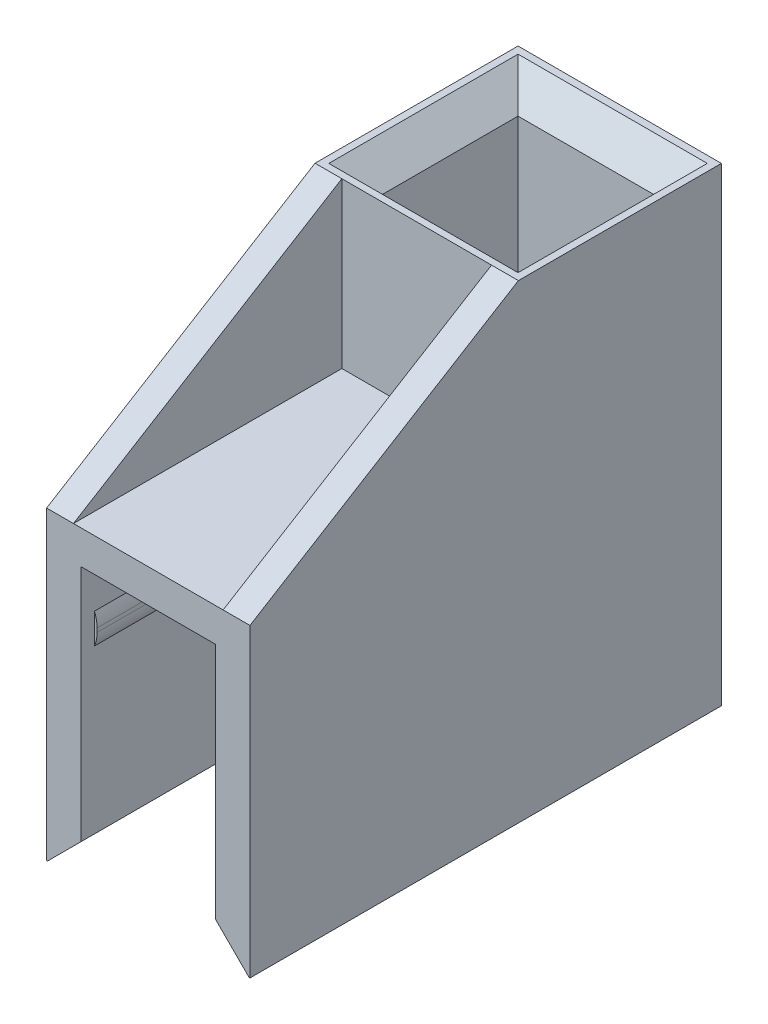
ISO-10303-21;
HEADER;
FILE_DESCRIPTION(('STEP AP214'),'2;1');
FILE_NAME('part.step','',(''),(''),'','','');
FILE_SCHEMA(('AUTOMOTIVE_DESIGN { 1 0 10303 214 1 1 1 1 }'));
ENDSEC;
DATA;
#1=APPLICATION_CONTEXT('core data for automotive mechanical design processes');
#2=APPLICATION_PROTOCOL_DEFINITION('international standard','automotive_design',2000,#1);
#3=PRODUCT_CONTEXT('',#1,'mechanical');
#4=PRODUCT('Part','Part','',(#3));
#5=PRODUCT_RELATED_PRODUCT_CATEGORY('part','',(#4));
#6=PRODUCT_DEFINITION_FORMATION('','',#4);
#7=PRODUCT_DEFINITION_CONTEXT('part definition',#1,'design');
#8=PRODUCT_DEFINITION('design','',#6,#7);
#9=PRODUCT_DEFINITION_SHAPE('','',#8);
#10=(LENGTH_UNIT() NAMED_UNIT(*) SI_UNIT(.MILLI.,.METRE.));
#11=(NAMED_UNIT(*) PLANE_ANGLE_UNIT() SI_UNIT($,.RADIAN.));
#12=(NAMED_UNIT(*) SI_UNIT($,.STERADIAN.) SOLID_ANGLE_UNIT());
#13=UNCERTAINTY_MEASURE_WITH_UNIT(LENGTH_MEASURE(1.E-05),#10,'distance_accuracy_value','');
#14=(GEOMETRIC_REPRESENTATION_CONTEXT(3) GLOBAL_UNCERTAINTY_ASSIGNED_CONTEXT((#13)) GLOBAL_UNIT_ASSIGNED_CONTEXT((#10,
#11,#12)) REPRESENTATION_CONTEXT('',''));
#15=CARTESIAN_POINT('',(0.,0.,0.));
#16=DIRECTION('',(0.,0.,1.));
#17=DIRECTION('',(1.,0.,0.));
#18=AXIS2_PLACEMENT_3D('',#15,#16,#17);
#19=CARTESIAN_POINT('',(10.025,0.,40.));
#20=DIRECTION('',(1.,0.,0.));
#21=DIRECTION('',(0.,0.,-1.));
#22=AXIS2_PLACEMENT_3D('',#19,#20,#21);
#23=PLANE('',#22);
#24=DIRECTION('',(0.,-1.,0.));
#25=VECTOR('',#24,1.);
#26=CARTESIAN_POINT('',(10.025,0.,0.));
#27=LINE('',#26,#25);
#28=CARTESIAN_POINT('',(10.025,20.5,0.));
#29=VERTEX_POINT('',#28);
#30=CARTESIAN_POINT('',(10.025,-15.,0.));
#31=VERTEX_POINT('',#30);
#32=EDGE_CURVE('E311',#29,#31,#27,.T.);
#33=ORIENTED_EDGE('',*,*,#32,.T.);
#34=DIRECTION('',(0.,0.,1.));
#35=VECTOR('',#34,1.);
#36=CARTESIAN_POINT('',(10.025,-15.,40.));
#37=LINE('',#36,#35);
#38=CARTESIAN_POINT('',(10.025,-15.,40.));
#39=VERTEX_POINT('',#38);
#40=EDGE_CURVE('E432',#31,#39,#37,.T.);
#41=ORIENTED_EDGE('',*,*,#40,.T.);
#42=DIRECTION('',(0.,-1.,0.));
#43=VECTOR('',#42,1.);
#44=CARTESIAN_POINT('',(10.025,0.,40.));
#45=LINE('',#44,#43);
#46=CARTESIAN_POINT('',(10.025,20.5,40.));
#47=VERTEX_POINT('',#46);
#48=EDGE_CURVE('E326',#47,#39,#45,.T.);
#49=ORIENTED_EDGE('',*,*,#48,.F.);
#50=DIRECTION('',(0.,0.,-1.));
#51=VECTOR('',#50,1.);
#52=CARTESIAN_POINT('',(10.025,20.5,40.));
#53=LINE('',#52,#51);
#54=EDGE_CURVE('E331',#47,#29,#53,.T.);
#55=ORIENTED_EDGE('',*,*,#54,.T.);
#56=EDGE_LOOP('',(#33,#41,#49,#55));
#57=FACE_BOUND('',#56,.T.);
#58=DIRECTION('',(0.,0.,1.));
#59=VECTOR('',#58,1.);
#60=CARTESIAN_POINT('',(10.025,9.25000000000001,0.));
#61=LINE('',#60,#59);
#62=CARTESIAN_POINT('',(10.025,9.25000000000001,2.));
#63=VERTEX_POINT('',#62);
#64=CARTESIAN_POINT('',(10.025,9.25000000000001,38.));
#65=VERTEX_POINT('',#64);
#66=EDGE_CURVE('E229',#63,#65,#61,.T.);
#67=ORIENTED_EDGE('',*,*,#66,.F.);
#68=DIRECTION('',(0.,-1.,0.));
#69=VECTOR('',#68,1.);
#70=CARTESIAN_POINT('',(10.025,0.,2.));
#71=LINE('',#70,#69);
#72=CARTESIAN_POINT('',(10.025,13.75,2.));
#73=VERTEX_POINT('',#72);
#74=EDGE_CURVE('E230',#73,#63,#71,.T.);
#75=ORIENTED_EDGE('',*,*,#74,.F.);
#76=DIRECTION('',(0.,0.,-1.));
#77=VECTOR('',#76,1.);
#78=CARTESIAN_POINT('',(10.025,13.75,0.));
#79=LINE('',#78,#77);
#80=CARTESIAN_POINT('',(10.025,13.75,38.));
#81=VERTEX_POINT('',#80);
#82=EDGE_CURVE('E237',#81,#73,#79,.T.);
#83=ORIENTED_EDGE('',*,*,#82,.F.);
#84=DIRECTION('',(0.,-1.,0.));
#85=VECTOR('',#84,1.);
#86=CARTESIAN_POINT('',(10.025,0.,38.));
#87=LINE('',#86,#85);
#88=EDGE_CURVE('E232',#81,#65,#87,.T.);
#89=ORIENTED_EDGE('',*,*,#88,.T.);
#90=EDGE_LOOP('',(#67,#75,#83,#89));
#91=FACE_BOUND('',#90,.T.);
#92=ADVANCED_FACE('F43',(#57,#91),#23,.F.);
#93=CARTESIAN_POINT('',(62.0568225314826,52.2270196568572,-3.63595046017497));
#94=DIRECTION('',(0.,0.85275441484345,0.522312079091614));
#95=DIRECTION('',(0.,-0.522312079091614,0.852754414843451));
#96=AXIS2_PLACEMENT_3D('',#93,#94,#95);
#97=PLANE('',#96);
#98=DIRECTION('',(-1.,0.,0.));
#99=VECTOR('',#98,1.);
#100=CARTESIAN_POINT('',(0.,25.5,40.));
#101=LINE('',#100,#99);
#102=CARTESIAN_POINT('',(-11.15,25.5,40.));
#103=VERTEX_POINT('',#102);
#104=CARTESIAN_POINT('',(-15.15,25.5,40.));
#105=VERTEX_POINT('',#104);
#106=EDGE_CURVE('E310',#103,#105,#101,.T.);
#107=ORIENTED_EDGE('',*,*,#106,.F.);
#108=DIRECTION('',(0.,0.522312079091614,-0.852754414843451));
#109=VECTOR('',#108,1.);
#110=CARTESIAN_POINT('',(-11.15,52.2270196568572,-3.63595046017497));
#111=LINE('',#110,#109);
#112=CARTESIAN_POINT('',(-11.15,50.,0.));
#113=VERTEX_POINT('',#112);
#114=EDGE_CURVE('E422',#103,#113,#111,.T.);
#115=ORIENTED_EDGE('',*,*,#114,.T.);
#116=DIRECTION('',(-1.,0.,0.));
#117=VECTOR('',#116,1.);
#118=CARTESIAN_POINT('',(-15.15,50.,0.));
#119=LINE('',#118,#117);
#120=CARTESIAN_POINT('',(-15.15,50.,0.));
#121=VERTEX_POINT('',#120);
#122=EDGE_CURVE('E377',#113,#121,#119,.T.);
#123=ORIENTED_EDGE('',*,*,#122,.T.);
#124=DIRECTION('',(0.,0.522312079091614,-0.852754414843451));
#125=VECTOR('',#124,1.);
#126=CARTESIAN_POINT('',(-15.15,52.2270196568572,-3.63595046017497));
#127=LINE('',#126,#125);
#128=EDGE_CURVE('E301',#105,#121,#127,.T.);
#129=ORIENTED_EDGE('',*,*,#128,.F.);
#130=EDGE_LOOP('',(#107,#115,#123,#129));
#131=FACE_BOUND('',#130,.T.);
#132=ADVANCED_FACE('F486',(#131),#97,.T.);
#133=CARTESIAN_POINT('',(15.15,50.,0.));
#134=VERTEX_POINT('',#133);
#135=CARTESIAN_POINT('',(11.15,50.,0.));
#136=VERTEX_POINT('',#135);
#137=EDGE_CURVE('E378',#134,#136,#119,.T.);
#138=ORIENTED_EDGE('',*,*,#137,.T.);
#139=DIRECTION('',(0.,-0.522312079091614,0.852754414843451));
#140=VECTOR('',#139,1.);
#141=CARTESIAN_POINT('',(11.15,52.2270196568572,-3.63595046017497));
#142=LINE('',#141,#140);
#143=CARTESIAN_POINT('',(11.15,25.5,40.));
#144=VERTEX_POINT('',#143);
#145=EDGE_CURVE('E411',#136,#144,#142,.T.);
#146=ORIENTED_EDGE('',*,*,#145,.T.);
#147=CARTESIAN_POINT('',(15.15,25.5,40.));
#148=VERTEX_POINT('',#147);
#149=EDGE_CURVE('E312',#148,#144,#101,.T.);
#150=ORIENTED_EDGE('',*,*,#149,.F.);
#151=DIRECTION('',(0.,0.522312079091614,-0.852754414843451));
#152=VECTOR('',#151,1.);
#153=CARTESIAN_POINT('',(15.15,52.2270196568572,-3.63595046017497));
#154=LINE('',#153,#152);
#155=EDGE_CURVE('E304',#148,#134,#154,.T.);
#156=ORIENTED_EDGE('',*,*,#155,.T.);
#157=EDGE_LOOP('',(#138,#146,#150,#156));
#158=FACE_BOUND('',#157,.T.);
#159=ADVANCED_FACE('F492',(#158),#97,.T.);
#160=CARTESIAN_POINT('',(0.,0.,0.));
#161=DIRECTION('',(0.,0.,1.));
#162=DIRECTION('',(1.,0.,0.));
#163=AXIS2_PLACEMENT_3D('',#160,#161,#162);
#164=PLANE('',#163);
#165=DIRECTION('',(0.,-1.,0.));
#166=VECTOR('',#165,1.);
#167=CARTESIAN_POINT('',(-10.025,0.,0.));
#168=LINE('',#167,#166);
#169=CARTESIAN_POINT('',(-10.025,20.5,0.));
#170=VERTEX_POINT('',#169);
#171=CARTESIAN_POINT('',(-10.025,-15.,0.));
#172=VERTEX_POINT('',#171);
#173=EDGE_CURVE('E306',#170,#172,#168,.T.);
#174=ORIENTED_EDGE('',*,*,#173,.T.);
#175=DIRECTION('',(1.,0.,0.));
#176=VECTOR('',#175,1.);
#177=CARTESIAN_POINT('',(0.,-15.,0.));
#178=LINE('',#177,#176);
#179=EDGE_CURVE('E438',#172,#31,#178,.T.);
#180=ORIENTED_EDGE('',*,*,#179,.T.);
#181=ORIENTED_EDGE('',*,*,#32,.F.);
#182=DIRECTION('',(-1.,0.,0.));
#183=VECTOR('',#182,1.);
#184=CARTESIAN_POINT('',(0.,20.5,0.));
#185=LINE('',#184,#183);
#186=EDGE_CURVE('E334',#29,#170,#185,.T.);
#187=ORIENTED_EDGE('',*,*,#186,.T.);
#188=EDGE_LOOP('',(#174,#180,#181,#187));
#189=FACE_BOUND('',#188,.T.);
#190=ADVANCED_FACE('F531',(#189),#164,.T.);
#191=CARTESIAN_POINT('',(0.,0.,-5.));
#192=DIRECTION('',(0.,0.,1.));
#193=DIRECTION('',(1.,0.,0.));
#194=AXIS2_PLACEMENT_3D('',#191,#192,#193);
#195=PLANE('',#194);
#196=DIRECTION('',(0.,-1.,0.));
#197=VECTOR('',#196,1.);
#198=CARTESIAN_POINT('',(-10.1,89.4417608633286,-5.));
#199=LINE('',#198,#197);
#200=CARTESIAN_POINT('',(-10.1,46.,-5.));
#201=VERTEX_POINT('',#200);
#202=CARTESIAN_POINT('',(-10.1,-16.,-5.));
#203=VERTEX_POINT('',#202);
#204=EDGE_CURVE('E371',#201,#203,#199,.T.);
#205=ORIENTED_EDGE('',*,*,#204,.F.);
#206=DIRECTION('',(1.,0.,0.));
#207=VECTOR('',#206,1.);
#208=CARTESIAN_POINT('',(10.1,46.,-5.));
#209=LINE('',#208,#207);
#210=CARTESIAN_POINT('',(10.1,46.,-5.));
#211=VERTEX_POINT('',#210);
#212=EDGE_CURVE('E402',#201,#211,#209,.T.);
#213=ORIENTED_EDGE('',*,*,#212,.T.);
#214=DIRECTION('',(0.,-1.,0.));
#215=VECTOR('',#214,1.);
#216=CARTESIAN_POINT('',(10.1,89.4417608633286,-5.));
#217=LINE('',#216,#215);
#218=CARTESIAN_POINT('',(10.1,-16.,-5.));
#219=VERTEX_POINT('',#218);
#220=EDGE_CURVE('E361',#211,#219,#217,.T.);
#221=ORIENTED_EDGE('',*,*,#220,.T.);
#222=DIRECTION('',(-1.,0.,0.));
#223=VECTOR('',#222,1.);
#224=CARTESIAN_POINT('',(-15.15,-16.,-5.));
#225=LINE('',#224,#223);
#226=EDGE_CURVE('E347',#219,#203,#225,.T.);
#227=ORIENTED_EDGE('',*,*,#226,.T.);
#228=EDGE_LOOP('',(#205,#213,#221,#227));
#229=FACE_BOUND('',#228,.T.);
#230=ADVANCED_FACE('F527',(#229),#195,.F.);
#231=CARTESIAN_POINT('',(10.1,89.4417608633286,-5.));
#232=DIRECTION('',(-1.,0.,0.));
#233=DIRECTION('',(0.,0.,1.));
#234=AXIS2_PLACEMENT_3D('',#231,#232,#233);
#235=PLANE('',#234);
#236=ORIENTED_EDGE('',*,*,#220,.F.);
#237=DIRECTION('',(0.,0.,-1.));
#238=VECTOR('',#237,1.);
#239=CARTESIAN_POINT('',(10.1,46.,-5.));
#240=LINE('',#239,#238);
#241=CARTESIAN_POINT('',(10.1,46.,-25.2));
#242=VERTEX_POINT('',#241);
#243=EDGE_CURVE('E405',#211,#242,#240,.T.);
#244=ORIENTED_EDGE('',*,*,#243,.T.);
#245=DIRECTION('',(0.,-1.,0.));
#246=VECTOR('',#245,1.);
#247=CARTESIAN_POINT('',(10.1,89.4417608633286,-25.2));
#248=LINE('',#247,#246);
#249=CARTESIAN_POINT('',(10.1,-16.,-25.2));
#250=VERTEX_POINT('',#249);
#251=EDGE_CURVE('E365',#242,#250,#248,.T.);
#252=ORIENTED_EDGE('',*,*,#251,.T.);
#253=DIRECTION('',(0.,0.,1.));
#254=VECTOR('',#253,1.);
#255=CARTESIAN_POINT('',(10.1,-16.,-5.));
#256=LINE('',#255,#254);
#257=EDGE_CURVE('E344',#250,#219,#256,.T.);
#258=ORIENTED_EDGE('',*,*,#257,.T.);
#259=EDGE_LOOP('',(#236,#244,#252,#258));
#260=FACE_BOUND('',#259,.T.);
#261=ADVANCED_FACE('F523',(#260),#235,.T.);
#262=CARTESIAN_POINT('',(-15.15,89.4417608633286,-25.2));
#263=DIRECTION('',(0.,0.,1.));
#264=DIRECTION('',(1.,0.,0.));
#265=AXIS2_PLACEMENT_3D('',#262,#263,#264);
#266=PLANE('',#265);
#267=ORIENTED_EDGE('',*,*,#251,.F.);
#268=DIRECTION('',(-1.,0.,0.));
#269=VECTOR('',#268,1.);
#270=CARTESIAN_POINT('',(-15.15,46.,-25.2));
#271=LINE('',#270,#269);
#272=CARTESIAN_POINT('',(-10.1,46.,-25.2));
#273=VERTEX_POINT('',#272);
#274=EDGE_CURVE('E407',#242,#273,#271,.T.);
#275=ORIENTED_EDGE('',*,*,#274,.T.);
#276=DIRECTION('',(0.,-1.,0.));
#277=VECTOR('',#276,1.);
#278=CARTESIAN_POINT('',(-10.1,89.4417608633286,-25.2));
#279=LINE('',#278,#277);
#280=CARTESIAN_POINT('',(-10.1,-16.,-25.2));
#281=VERTEX_POINT('',#280);
#282=EDGE_CURVE('E373',#273,#281,#279,.T.);
#283=ORIENTED_EDGE('',*,*,#282,.T.);
#284=DIRECTION('',(1.,0.,0.));
#285=VECTOR('',#284,1.);
#286=CARTESIAN_POINT('',(-15.15,-16.,-25.2));
#287=LINE('',#286,#285);
#288=EDGE_CURVE('E354',#281,#250,#287,.T.);
#289=ORIENTED_EDGE('',*,*,#288,.T.);
#290=EDGE_LOOP('',(#267,#275,#283,#289));
#291=FACE_BOUND('',#290,.T.);
#292=ADVANCED_FACE('F519',(#291),#266,.T.);
#293=CARTESIAN_POINT('',(-10.1,89.4417608633286,-5.));
#294=DIRECTION('',(1.,0.,0.));
#295=DIRECTION('',(0.,0.,-1.));
#296=AXIS2_PLACEMENT_3D('',#293,#294,#295);
#297=PLANE('',#296);
#298=ORIENTED_EDGE('',*,*,#282,.F.);
#299=DIRECTION('',(0.,0.,1.));
#300=VECTOR('',#299,1.);
#301=CARTESIAN_POINT('',(-10.1,46.,-5.));
#302=LINE('',#301,#300);
#303=EDGE_CURVE('E409',#273,#201,#302,.T.);
#304=ORIENTED_EDGE('',*,*,#303,.T.);
#305=ORIENTED_EDGE('',*,*,#204,.T.);
#306=DIRECTION('',(0.,0.,-1.));
#307=VECTOR('',#306,1.);
#308=CARTESIAN_POINT('',(-10.1,-16.,-5.));
#309=LINE('',#308,#307);
#310=EDGE_CURVE('E351',#203,#281,#309,.T.);
#311=ORIENTED_EDGE('',*,*,#310,.T.);
#312=EDGE_LOOP('',(#298,#304,#305,#311));
#313=FACE_BOUND('',#312,.T.);
#314=ADVANCED_FACE('F515',(#313),#297,.T.);
#315=CARTESIAN_POINT('',(15.15,50.,-5.));
#316=DIRECTION('',(1.,0.,0.));
#317=DIRECTION('',(0.,1.,0.));
#318=AXIS2_PLACEMENT_3D('',#315,#316,#317);
#319=PLANE('',#318);
#320=DIRECTION('',(0.,0.,1.));
#321=VECTOR('',#320,1.);
#322=CARTESIAN_POINT('',(15.15,50.,-5.));
#323=LINE('',#322,#321);
#324=CARTESIAN_POINT('',(15.15,50.,-30.25));
#325=VERTEX_POINT('',#324);
#326=EDGE_CURVE('E381',#325,#134,#323,.T.);
#327=ORIENTED_EDGE('',*,*,#326,.T.);
#328=ORIENTED_EDGE('',*,*,#155,.F.);
#329=DIRECTION('',(0.,1.,0.));
#330=VECTOR('',#329,1.);
#331=CARTESIAN_POINT('',(15.15,0.,40.));
#332=LINE('',#331,#330);
#333=CARTESIAN_POINT('',(15.15,-20.,40.));
#334=VERTEX_POINT('',#333);
#335=EDGE_CURVE('E307',#334,#148,#332,.T.);
#336=ORIENTED_EDGE('',*,*,#335,.F.);
#337=DIRECTION('',(0.,0.,1.));
#338=VECTOR('',#337,1.);
#339=CARTESIAN_POINT('',(15.15,-20.,-5.));
#340=LINE('',#339,#338);
#341=CARTESIAN_POINT('',(15.15,-20.,-30.25));
#342=VERTEX_POINT('',#341);
#343=EDGE_CURVE('E382',#342,#334,#340,.T.);
#344=ORIENTED_EDGE('',*,*,#343,.F.);
#345=DIRECTION('',(0.,-1.,0.));
#346=VECTOR('',#345,1.);
#347=CARTESIAN_POINT('',(15.15,89.4417608633286,-30.25));
#348=LINE('',#347,#346);
#349=EDGE_CURVE('E362',#325,#342,#348,.T.);
#350=ORIENTED_EDGE('',*,*,#349,.F.);
#351=EDGE_LOOP('',(#327,#328,#336,#344,#350));
#352=FACE_BOUND('',#351,.T.);
#353=ADVANCED_FACE('F518',(#352),#319,.T.);
#354=CARTESIAN_POINT('',(-15.15,-20.,-5.));
#355=DIRECTION('',(0.,-1.,0.));
#356=DIRECTION('',(1.,0.,0.));
#357=AXIS2_PLACEMENT_3D('',#354,#355,#356);
#358=PLANE('',#357);
#359=DIRECTION('',(1.,0.,0.));
#360=VECTOR('',#359,1.);
#361=CARTESIAN_POINT('',(0.,-20.,40.));
#362=LINE('',#361,#360);
#363=CARTESIAN_POINT('',(15.025,-20.,40.));
#364=VERTEX_POINT('',#363);
#365=EDGE_CURVE('E329',#364,#334,#362,.T.);
#366=ORIENTED_EDGE('',*,*,#365,.F.);
#367=DIRECTION('',(0.,0.,-1.));
#368=VECTOR('',#367,1.);
#369=CARTESIAN_POINT('',(15.025,-20.,0.));
#370=LINE('',#369,#368);
#371=CARTESIAN_POINT('',(15.025,-20.,-4.99999999999999));
#372=VERTEX_POINT('',#371);
#373=EDGE_CURVE('E429',#364,#372,#370,.T.);
#374=ORIENTED_EDGE('',*,*,#373,.T.);
#375=DIRECTION('',(-1.,0.,0.));
#376=VECTOR('',#375,1.);
#377=CARTESIAN_POINT('',(-15.15,-20.,-4.99999999999999));
#378=LINE('',#377,#376);
#379=CARTESIAN_POINT('',(-15.025,-20.,-4.99999999999999));
#380=VERTEX_POINT('',#379);
#381=EDGE_CURVE('E427',#372,#380,#378,.T.);
#382=ORIENTED_EDGE('',*,*,#381,.T.);
#383=DIRECTION('',(0.,0.,1.));
#384=VECTOR('',#383,1.);
#385=CARTESIAN_POINT('',(-15.025,-20.,-5.));
#386=LINE('',#385,#384);
#387=CARTESIAN_POINT('',(-15.025,-20.,40.));
#388=VERTEX_POINT('',#387);
#389=EDGE_CURVE('E425',#380,#388,#386,.T.);
#390=ORIENTED_EDGE('',*,*,#389,.T.);
#391=DIRECTION('',(-1.,0.,0.));
#392=VECTOR('',#391,1.);
#393=CARTESIAN_POINT('',(0.,-20.,40.));
#394=LINE('',#393,#392);
#395=CARTESIAN_POINT('',(-15.15,-20.,40.));
#396=VERTEX_POINT('',#395);
#397=EDGE_CURVE('E318',#388,#396,#394,.T.);
#398=ORIENTED_EDGE('',*,*,#397,.T.);
#399=DIRECTION('',(0.,0.,1.));
#400=VECTOR('',#399,1.);
#401=CARTESIAN_POINT('',(-15.15,-20.,-5.));
#402=LINE('',#401,#400);
#403=CARTESIAN_POINT('',(-15.15,-20.,-30.25));
#404=VERTEX_POINT('',#403);
#405=EDGE_CURVE('E386',#404,#396,#402,.T.);
#406=ORIENTED_EDGE('',*,*,#405,.F.);
#407=DIRECTION('',(-1.,0.,0.));
#408=VECTOR('',#407,1.);
#409=CARTESIAN_POINT('',(-15.15,-20.,-30.25));
#410=LINE('',#409,#408);
#411=EDGE_CURVE('E358',#342,#404,#410,.T.);
#412=ORIENTED_EDGE('',*,*,#411,.F.);
#413=ORIENTED_EDGE('',*,*,#343,.T.);
#414=EDGE_LOOP('',(#366,#374,#382,#390,#398,#406,#412,#413));
#415=FACE_BOUND('',#414,.T.);
#416=ADVANCED_FACE('F536',(#415),#358,.T.);
#417=CARTESIAN_POINT('',(-15.15,50.,-5.));
#418=DIRECTION('',(-1.,0.,0.));
#419=DIRECTION('',(0.,-1.,0.));
#420=AXIS2_PLACEMENT_3D('',#417,#418,#419);
#421=PLANE('',#420);
#422=ORIENTED_EDGE('',*,*,#128,.T.);
#423=DIRECTION('',(0.,0.,1.));
#424=VECTOR('',#423,1.);
#425=CARTESIAN_POINT('',(-15.15,50.,-5.));
#426=LINE('',#425,#424);
#427=CARTESIAN_POINT('',(-15.15,50.,-30.25));
#428=VERTEX_POINT('',#427);
#429=EDGE_CURVE('E389',#428,#121,#426,.T.);
#430=ORIENTED_EDGE('',*,*,#429,.F.);
#431=DIRECTION('',(0.,-1.,0.));
#432=VECTOR('',#431,1.);
#433=CARTESIAN_POINT('',(-15.15,89.4417608633286,-30.25));
#434=LINE('',#433,#432);
#435=EDGE_CURVE('E368',#428,#404,#434,.T.);
#436=ORIENTED_EDGE('',*,*,#435,.T.);
#437=ORIENTED_EDGE('',*,*,#405,.T.);
#438=DIRECTION('',(0.,1.,0.));
#439=VECTOR('',#438,1.);
#440=CARTESIAN_POINT('',(-15.15,0.,40.));
#441=LINE('',#440,#439);
#442=EDGE_CURVE('E315',#396,#105,#441,.T.);
#443=ORIENTED_EDGE('',*,*,#442,.T.);
#444=EDGE_LOOP('',(#422,#430,#436,#437,#443));
#445=FACE_BOUND('',#444,.T.);
#446=ADVANCED_FACE('F539',(#445),#421,.T.);
#447=CARTESIAN_POINT('',(-15.15,50.,-5.));
#448=DIRECTION('',(0.,1.,0.));
#449=DIRECTION('',(-1.,0.,0.));
#450=AXIS2_PLACEMENT_3D('',#447,#448,#449);
#451=PLANE('',#450);
#452=DIRECTION('',(0.,0.,1.));
#453=VECTOR('',#452,1.);
#454=CARTESIAN_POINT('',(14.1,50.,-5.));
#455=LINE('',#454,#453);
#456=CARTESIAN_POINT('',(14.1,50.,-29.2));
#457=VERTEX_POINT('',#456);
#458=CARTESIAN_POINT('',(14.1,50.,-0.999999999999977));
#459=VERTEX_POINT('',#458);
#460=EDGE_CURVE('E397',#457,#459,#455,.T.);
#461=ORIENTED_EDGE('',*,*,#460,.T.);
#462=DIRECTION('',(-1.,0.,0.));
#463=VECTOR('',#462,1.);
#464=CARTESIAN_POINT('',(-10.1,50.,-0.999999999999977));
#465=LINE('',#464,#463);
#466=CARTESIAN_POINT('',(-14.1,50.,-0.999999999999977));
#467=VERTEX_POINT('',#466);
#468=EDGE_CURVE('E399',#459,#467,#465,.T.);
#469=ORIENTED_EDGE('',*,*,#468,.T.);
#470=DIRECTION('',(0.,0.,-1.));
#471=VECTOR('',#470,1.);
#472=CARTESIAN_POINT('',(-14.1,50.,-5.));
#473=LINE('',#472,#471);
#474=CARTESIAN_POINT('',(-14.1,50.,-29.2));
#475=VERTEX_POINT('',#474);
#476=EDGE_CURVE('E385',#467,#475,#473,.T.);
#477=ORIENTED_EDGE('',*,*,#476,.T.);
#478=DIRECTION('',(1.,0.,0.));
#479=VECTOR('',#478,1.);
#480=CARTESIAN_POINT('',(-15.15,50.,-29.2));
#481=LINE('',#480,#479);
#482=EDGE_CURVE('E395',#475,#457,#481,.T.);
#483=ORIENTED_EDGE('',*,*,#482,.T.);
#484=EDGE_LOOP('',(#461,#469,#477,#483));
#485=FACE_BOUND('',#484,.T.);
#486=ORIENTED_EDGE('',*,*,#137,.F.);
#487=ORIENTED_EDGE('',*,*,#326,.F.);
#488=DIRECTION('',(-1.,0.,0.));
#489=VECTOR('',#488,1.);
#490=CARTESIAN_POINT('',(-15.15,50.,-30.25));
#491=LINE('',#490,#489);
#492=EDGE_CURVE('E357',#325,#428,#491,.T.);
#493=ORIENTED_EDGE('',*,*,#492,.T.);
#494=ORIENTED_EDGE('',*,*,#429,.T.);
#495=ORIENTED_EDGE('',*,*,#122,.F.);
#496=DIRECTION('',(-1.,0.,0.));
#497=VECTOR('',#496,1.);
#498=CARTESIAN_POINT('',(-11.15,50.,0.));
#499=LINE('',#498,#497);
#500=EDGE_CURVE('E286',#136,#113,#499,.T.);
#501=ORIENTED_EDGE('',*,*,#500,.F.);
#502=EDGE_LOOP('',(#486,#487,#493,#494,#495,#501));
#503=FACE_BOUND('',#502,.T.);
#504=ADVANCED_FACE('F513',(#485,#503),#451,.T.);
#505=CARTESIAN_POINT('',(-15.15,89.4417608633286,-30.25));
#506=DIRECTION('',(0.,0.,1.));
#507=DIRECTION('',(1.,0.,0.));
#508=AXIS2_PLACEMENT_3D('',#505,#506,#507);
#509=PLANE('',#508);
#510=ORIENTED_EDGE('',*,*,#492,.F.);
#511=ORIENTED_EDGE('',*,*,#349,.T.);
#512=ORIENTED_EDGE('',*,*,#411,.T.);
#513=ORIENTED_EDGE('',*,*,#435,.F.);
#514=EDGE_LOOP('',(#510,#511,#512,#513));
#515=FACE_BOUND('',#514,.T.);
#516=ADVANCED_FACE('F509',(#515),#509,.F.);
#517=CARTESIAN_POINT('',(0.,-16.,0.));
#518=DIRECTION('',(0.,-1.,0.));
#519=DIRECTION('',(1.,0.,0.));
#520=AXIS2_PLACEMENT_3D('',#517,#518,#519);
#521=PLANE('',#520);
#522=ORIENTED_EDGE('',*,*,#257,.F.);
#523=ORIENTED_EDGE('',*,*,#288,.F.);
#524=ORIENTED_EDGE('',*,*,#310,.F.);
#525=ORIENTED_EDGE('',*,*,#226,.F.);
#526=EDGE_LOOP('',(#522,#523,#524,#525));
#527=FACE_BOUND('',#526,.T.);
#528=ADVANCED_FACE('F505',(#527),#521,.F.);
#529=CARTESIAN_POINT('',(-15.15,46.,-25.2));
#530=DIRECTION('',(0.,-0.707106781186549,-0.707106781186546));
#531=DIRECTION('',(-1.,0.,0.));
#532=AXIS2_PLACEMENT_3D('',#529,#530,#531);
#533=PLANE('',#532);
#534=DIRECTION('',(-0.577350269189626,0.577350269189624,-0.577350269189627));
#535=VECTOR('',#534,1.);
#536=CARTESIAN_POINT('',(-11.7833333333333,47.6833333333333,-26.8833333333333));
#537=LINE('',#536,#535);
#538=EDGE_CURVE('E415',#273,#475,#537,.T.);
#539=ORIENTED_EDGE('',*,*,#538,.F.);
#540=ORIENTED_EDGE('',*,*,#274,.F.);
#541=DIRECTION('',(0.577350269189626,0.577350269189625,-0.577350269189627));
#542=VECTOR('',#541,1.);
#543=CARTESIAN_POINT('',(3.36666666666665,39.2666666666667,-18.4666666666667));
#544=LINE('',#543,#542);
#545=EDGE_CURVE('E348',#457,#242,#544,.F.);
#546=ORIENTED_EDGE('',*,*,#545,.F.);
#547=ORIENTED_EDGE('',*,*,#482,.F.);
#548=EDGE_LOOP('',(#539,#540,#546,#547));
#549=FACE_BOUND('',#548,.T.);
#550=ADVANCED_FACE('F508',(#549),#533,.F.);
#551=CARTESIAN_POINT('',(10.1,46.,-5.));
#552=DIRECTION('',(0.707106781186547,-0.707106781186548,0.));
#553=DIRECTION('',(0.,0.,-1.));
#554=AXIS2_PLACEMENT_3D('',#551,#552,#553);
#555=PLANE('',#554);
#556=ORIENTED_EDGE('',*,*,#545,.T.);
#557=ORIENTED_EDGE('',*,*,#243,.F.);
#558=DIRECTION('',(-0.577350269189626,-0.577350269189625,-0.577350269189626));
#559=VECTOR('',#558,1.);
#560=CARTESIAN_POINT('',(4.34999999999999,40.25,-10.75));
#561=LINE('',#560,#559);
#562=EDGE_CURVE('E413',#459,#211,#561,.T.);
#563=ORIENTED_EDGE('',*,*,#562,.F.);
#564=ORIENTED_EDGE('',*,*,#460,.F.);
#565=EDGE_LOOP('',(#556,#557,#563,#564));
#566=FACE_BOUND('',#565,.T.);
#567=ADVANCED_FACE('F564',(#566),#555,.F.);
#568=CARTESIAN_POINT('',(-10.1,46.,-5.));
#569=DIRECTION('',(-0.707106781186546,-0.707106781186549,0.));
#570=DIRECTION('',(0.,0.,1.));
#571=AXIS2_PLACEMENT_3D('',#568,#569,#570);
#572=PLANE('',#571);
#573=ORIENTED_EDGE('',*,*,#538,.T.);
#574=ORIENTED_EDGE('',*,*,#476,.F.);
#575=DIRECTION('',(-0.577350269189626,0.577350269189624,0.577350269189626));
#576=VECTOR('',#575,1.);
#577=CARTESIAN_POINT('',(-14.45,50.35,-0.649999999999985));
#578=LINE('',#577,#576);
#579=EDGE_CURVE('E343',#201,#467,#578,.T.);
#580=ORIENTED_EDGE('',*,*,#579,.F.);
#581=ORIENTED_EDGE('',*,*,#303,.F.);
#582=EDGE_LOOP('',(#573,#574,#580,#581));
#583=FACE_BOUND('',#582,.T.);
#584=ADVANCED_FACE('F557',(#583),#572,.F.);
#585=CARTESIAN_POINT('',(-15.15,50.,-0.999999999999977));
#586=DIRECTION('',(0.,0.707106781186549,-0.707106781186546));
#587=DIRECTION('',(1.,0.,0.));
#588=AXIS2_PLACEMENT_3D('',#585,#586,#587);
#589=PLANE('',#588);
#590=ORIENTED_EDGE('',*,*,#562,.T.);
#591=ORIENTED_EDGE('',*,*,#212,.F.);
#592=ORIENTED_EDGE('',*,*,#579,.T.);
#593=ORIENTED_EDGE('',*,*,#468,.F.);
#594=EDGE_LOOP('',(#590,#591,#592,#593));
#595=FACE_BOUND('',#594,.T.);
#596=ADVANCED_FACE('F504',(#595),#589,.T.);
#597=CARTESIAN_POINT('',(-10.025,0.,40.));
#598=DIRECTION('',(1.,0.,0.));
#599=DIRECTION('',(0.,0.,-1.));
#600=AXIS2_PLACEMENT_3D('',#597,#598,#599);
#601=PLANE('',#600);
#602=DIRECTION('',(0.,0.,-1.));
#603=VECTOR('',#602,1.);
#604=CARTESIAN_POINT('',(-10.025,13.75,0.));
#605=LINE('',#604,#603);
#606=CARTESIAN_POINT('',(-10.025,13.75,38.));
#607=VERTEX_POINT('',#606);
#608=CARTESIAN_POINT('',(-10.025,13.75,2.));
#609=VERTEX_POINT('',#608);
#610=EDGE_CURVE('E260',#607,#609,#605,.T.);
#611=ORIENTED_EDGE('',*,*,#610,.T.);
#612=DIRECTION('',(0.,-1.,0.));
#613=VECTOR('',#612,1.);
#614=CARTESIAN_POINT('',(-10.025,0.,2.));
#615=LINE('',#614,#613);
#616=CARTESIAN_POINT('',(-10.025,9.25,2.));
#617=VERTEX_POINT('',#616);
#618=EDGE_CURVE('E269',#609,#617,#615,.T.);
#619=ORIENTED_EDGE('',*,*,#618,.T.);
#620=DIRECTION('',(0.,0.,1.));
#621=VECTOR('',#620,1.);
#622=CARTESIAN_POINT('',(-10.025,9.25000000000001,0.));
#623=LINE('',#622,#621);
#624=CARTESIAN_POINT('',(-10.025,9.25,38.));
#625=VERTEX_POINT('',#624);
#626=EDGE_CURVE('E278',#617,#625,#623,.T.);
#627=ORIENTED_EDGE('',*,*,#626,.T.);
#628=DIRECTION('',(0.,-1.,0.));
#629=VECTOR('',#628,1.);
#630=CARTESIAN_POINT('',(-10.025,0.,38.));
#631=LINE('',#630,#629);
#632=EDGE_CURVE('E275',#607,#625,#631,.T.);
#633=ORIENTED_EDGE('',*,*,#632,.F.);
#634=EDGE_LOOP('',(#611,#619,#627,#633));
#635=FACE_BOUND('',#634,.T.);
#636=DIRECTION('',(0.,-1.,0.));
#637=VECTOR('',#636,1.);
#638=CARTESIAN_POINT('',(-10.025,0.,40.));
#639=LINE('',#638,#637);
#640=CARTESIAN_POINT('',(-10.025,20.5,40.));
#641=VERTEX_POINT('',#640);
#642=CARTESIAN_POINT('',(-10.025,-15.,40.));
#643=VERTEX_POINT('',#642);
#644=EDGE_CURVE('E320',#641,#643,#639,.T.);
#645=ORIENTED_EDGE('',*,*,#644,.T.);
#646=DIRECTION('',(0.,0.,-1.));
#647=VECTOR('',#646,1.);
#648=CARTESIAN_POINT('',(-10.025,-15.,40.));
#649=LINE('',#648,#647);
#650=EDGE_CURVE('E440',#643,#172,#649,.T.);
#651=ORIENTED_EDGE('',*,*,#650,.T.);
#652=ORIENTED_EDGE('',*,*,#173,.F.);
#653=DIRECTION('',(0.,0.,-1.));
#654=VECTOR('',#653,1.);
#655=CARTESIAN_POINT('',(-10.025,20.5,40.));
#656=LINE('',#655,#654);
#657=EDGE_CURVE('E340',#641,#170,#656,.T.);
#658=ORIENTED_EDGE('',*,*,#657,.F.);
#659=EDGE_LOOP('',(#645,#651,#652,#658));
#660=FACE_BOUND('',#659,.T.);
#661=ADVANCED_FACE('F463',(#635,#660),#601,.T.);
#662=CARTESIAN_POINT('',(0.,20.5,40.));
#663=DIRECTION('',(0.,-1.,0.));
#664=DIRECTION('',(0.,0.,-1.));
#665=AXIS2_PLACEMENT_3D('',#662,#663,#664);
#666=PLANE('',#665);
#667=ORIENTED_EDGE('',*,*,#186,.F.);
#668=ORIENTED_EDGE('',*,*,#54,.F.);
#669=DIRECTION('',(-1.,0.,0.));
#670=VECTOR('',#669,1.);
#671=CARTESIAN_POINT('',(0.,20.5,40.));
#672=LINE('',#671,#670);
#673=EDGE_CURVE('E323',#47,#641,#672,.T.);
#674=ORIENTED_EDGE('',*,*,#673,.T.);
#675=ORIENTED_EDGE('',*,*,#657,.T.);
#676=EDGE_LOOP('',(#667,#668,#674,#675));
#677=FACE_BOUND('',#676,.T.);
#678=ADVANCED_FACE('F498',(#677),#666,.T.);
#679=CARTESIAN_POINT('',(0.,0.,40.));
#680=DIRECTION('',(0.,0.,1.));
#681=DIRECTION('',(1.,0.,0.));
#682=AXIS2_PLACEMENT_3D('',#679,#680,#681);
#683=PLANE('',#682);
#684=ORIENTED_EDGE('',*,*,#48,.T.);
#685=DIRECTION('',(0.707106781186546,-0.707106781186549,0.));
#686=VECTOR('',#685,1.);
#687=CARTESIAN_POINT('',(-2.48749999999997,-2.48749999999995,40.));
#688=LINE('',#687,#686);
#689=EDGE_CURVE('E436',#39,#364,#688,.T.);
#690=ORIENTED_EDGE('',*,*,#689,.T.);
#691=ORIENTED_EDGE('',*,*,#365,.T.);
#692=ORIENTED_EDGE('',*,*,#335,.T.);
#693=ORIENTED_EDGE('',*,*,#149,.T.);
#694=DIRECTION('',(1.,0.,0.));
#695=VECTOR('',#694,1.);
#696=CARTESIAN_POINT('',(-11.15,25.5,40.));
#697=LINE('',#696,#695);
#698=EDGE_CURVE('E283',#103,#144,#697,.T.);
#699=ORIENTED_EDGE('',*,*,#698,.F.);
#700=ORIENTED_EDGE('',*,*,#106,.T.);
#701=ORIENTED_EDGE('',*,*,#442,.F.);
#702=ORIENTED_EDGE('',*,*,#397,.F.);
#703=DIRECTION('',(-0.707106781186545,-0.70710678118655,0.));
#704=VECTOR('',#703,1.);
#705=CARTESIAN_POINT('',(2.48749999999996,-2.48749999999994,40.));
#706=LINE('',#705,#704);
#707=EDGE_CURVE('E434',#388,#643,#706,.F.);
#708=ORIENTED_EDGE('',*,*,#707,.T.);
#709=ORIENTED_EDGE('',*,*,#644,.F.);
#710=ORIENTED_EDGE('',*,*,#673,.F.);
#711=EDGE_LOOP('',(#684,#690,#691,#692,#693,#699,#700,#701,#702,#708,#709,#710));
#712=FACE_BOUND('',#711,.T.);
#713=ADVANCED_FACE('F497',(#712),#683,.T.);
#714=CARTESIAN_POINT('',(-11.15,50.,40.));
#715=DIRECTION('',(1.,0.,0.));
#716=DIRECTION('',(0.,1.,0.));
#717=AXIS2_PLACEMENT_3D('',#714,#715,#716);
#718=PLANE('',#717);
#719=DIRECTION('',(0.,0.,-1.));
#720=VECTOR('',#719,1.);
#721=CARTESIAN_POINT('',(-11.15,25.5,40.));
#722=LINE('',#721,#720);
#723=CARTESIAN_POINT('',(-11.15,25.5,0.));
#724=VERTEX_POINT('',#723);
#725=EDGE_CURVE('E298',#103,#724,#722,.T.);
#726=ORIENTED_EDGE('',*,*,#725,.T.);
#727=DIRECTION('',(0.,-1.,0.));
#728=VECTOR('',#727,1.);
#729=CARTESIAN_POINT('',(-11.15,50.,0.));
#730=LINE('',#729,#728);
#731=EDGE_CURVE('E287',#113,#724,#730,.T.);
#732=ORIENTED_EDGE('',*,*,#731,.F.);
#733=ORIENTED_EDGE('',*,*,#114,.F.);
#734=EDGE_LOOP('',(#726,#732,#733));
#735=FACE_BOUND('',#734,.T.);
#736=ADVANCED_FACE('F637',(#735),#718,.T.);
#737=CARTESIAN_POINT('',(-11.15,25.5,40.));
#738=DIRECTION('',(0.,1.,0.));
#739=DIRECTION('',(0.,0.,1.));
#740=AXIS2_PLACEMENT_3D('',#737,#738,#739);
#741=PLANE('',#740);
#742=DIRECTION('',(1.,0.,0.));
#743=VECTOR('',#742,1.);
#744=CARTESIAN_POINT('',(-11.15,25.5,0.));
#745=LINE('',#744,#743);
#746=CARTESIAN_POINT('',(11.15,25.5,0.));
#747=VERTEX_POINT('',#746);
#748=EDGE_CURVE('E290',#724,#747,#745,.T.);
#749=ORIENTED_EDGE('',*,*,#748,.F.);
#750=ORIENTED_EDGE('',*,*,#725,.F.);
#751=ORIENTED_EDGE('',*,*,#698,.T.);
#752=DIRECTION('',(0.,0.,-1.));
#753=VECTOR('',#752,1.);
#754=CARTESIAN_POINT('',(11.15,25.5,40.));
#755=LINE('',#754,#753);
#756=EDGE_CURVE('E285',#144,#747,#755,.T.);
#757=ORIENTED_EDGE('',*,*,#756,.T.);
#758=EDGE_LOOP('',(#749,#750,#751,#757));
#759=FACE_BOUND('',#758,.T.);
#760=ADVANCED_FACE('F642',(#759),#741,.T.);
#761=CARTESIAN_POINT('',(11.15,50.,40.));
#762=DIRECTION('',(-1.,0.,0.));
#763=DIRECTION('',(0.,-1.,0.));
#764=AXIS2_PLACEMENT_3D('',#761,#762,#763);
#765=PLANE('',#764);
#766=DIRECTION('',(0.,1.,0.));
#767=VECTOR('',#766,1.);
#768=CARTESIAN_POINT('',(11.15,50.,0.));
#769=LINE('',#768,#767);
#770=EDGE_CURVE('E293',#747,#136,#769,.T.);
#771=ORIENTED_EDGE('',*,*,#770,.F.);
#772=ORIENTED_EDGE('',*,*,#756,.F.);
#773=ORIENTED_EDGE('',*,*,#145,.F.);
#774=EDGE_LOOP('',(#771,#772,#773));
#775=FACE_BOUND('',#774,.T.);
#776=ADVANCED_FACE('F600',(#775),#765,.T.);
#777=CARTESIAN_POINT('',(0.,0.,0.));
#778=DIRECTION('',(0.,0.,1.));
#779=DIRECTION('',(1.,0.,0.));
#780=AXIS2_PLACEMENT_3D('',#777,#778,#779);
#781=PLANE('',#780);
#782=ORIENTED_EDGE('',*,*,#731,.T.);
#783=ORIENTED_EDGE('',*,*,#748,.T.);
#784=ORIENTED_EDGE('',*,*,#770,.T.);
#785=ORIENTED_EDGE('',*,*,#500,.T.);
#786=EDGE_LOOP('',(#782,#783,#784,#785));
#787=FACE_BOUND('',#786,.T.);
#788=ADVANCED_FACE('F595',(#787),#781,.T.);
#789=CARTESIAN_POINT('',(-10.025,-15.,40.));
#790=DIRECTION('',(-0.70710678118655,0.707106781186545,0.));
#791=DIRECTION('',(0.,0.,-1.));
#792=AXIS2_PLACEMENT_3D('',#789,#790,#791);
#793=PLANE('',#792);
#794=ORIENTED_EDGE('',*,*,#707,.F.);
#795=ORIENTED_EDGE('',*,*,#389,.F.);
#796=DIRECTION('',(0.577350269189625,0.577350269189628,0.577350269189625));
#797=VECTOR('',#796,1.);
#798=CARTESIAN_POINT('',(-6.68333333333335,-11.6583333333333,3.34166666666666));
#799=LINE('',#798,#797);
#800=EDGE_CURVE('E291',#172,#380,#799,.F.);
#801=ORIENTED_EDGE('',*,*,#800,.F.);
#802=ORIENTED_EDGE('',*,*,#650,.F.);
#803=EDGE_LOOP('',(#794,#795,#801,#802));
#804=FACE_BOUND('',#803,.T.);
#805=ADVANCED_FACE('F590',(#804),#793,.F.);
#806=CARTESIAN_POINT('',(0.,-15.,0.));
#807=DIRECTION('',(0.,0.707106781186545,-0.707106781186549));
#808=DIRECTION('',(1.,0.,0.));
#809=AXIS2_PLACEMENT_3D('',#806,#807,#808);
#810=PLANE('',#809);
#811=ORIENTED_EDGE('',*,*,#800,.T.);
#812=ORIENTED_EDGE('',*,*,#381,.F.);
#813=DIRECTION('',(0.577350269189625,-0.577350269189628,-0.577350269189625));
#814=VECTOR('',#813,1.);
#815=CARTESIAN_POINT('',(15.025,-20.,-4.99999999999999));
#816=LINE('',#815,#814);
#817=EDGE_CURVE('E272',#31,#372,#816,.T.);
#818=ORIENTED_EDGE('',*,*,#817,.F.);
#819=ORIENTED_EDGE('',*,*,#179,.F.);
#820=EDGE_LOOP('',(#811,#812,#818,#819));
#821=FACE_BOUND('',#820,.T.);
#822=ADVANCED_FACE('F584',(#821),#810,.F.);
#823=CARTESIAN_POINT('',(15.025,-20.,-5.));
#824=DIRECTION('',(-0.707106781186549,-0.707106781186546,0.));
#825=DIRECTION('',(0.,0.,1.));
#826=AXIS2_PLACEMENT_3D('',#823,#824,#825);
#827=PLANE('',#826);
#828=ORIENTED_EDGE('',*,*,#689,.F.);
#829=ORIENTED_EDGE('',*,*,#40,.F.);
#830=ORIENTED_EDGE('',*,*,#817,.T.);
#831=ORIENTED_EDGE('',*,*,#373,.F.);
#832=EDGE_LOOP('',(#828,#829,#830,#831));
#833=FACE_BOUND('',#832,.T.);
#834=ADVANCED_FACE('F578',(#833),#827,.T.);
#835=CARTESIAN_POINT('',(-9.625,0.,38.));
#836=DIRECTION('',(0.,0.,-1.));
#837=DIRECTION('',(-1.,0.,0.));
#838=AXIS2_PLACEMENT_3D('',#835,#836,#837);
#839=PLANE('',#838);
#840=ORIENTED_EDGE('',*,*,#632,.T.);
#841=CARTESIAN_POINT('',(-14.625,11.2095917942265,38.));
#842=DIRECTION('',(0.,0.,-1.));
#843=DIRECTION('',(-1.,0.,0.));
#844=AXIS2_PLACEMENT_3D('',#841,#842,#843);
#845=CIRCLE('',#844,5.);
#846=CARTESIAN_POINT('',(-9.625,11.2095917942265,38.));
#847=VERTEX_POINT('',#846);
#848=EDGE_CURVE('E447',#625,#847,#845,.F.);
#849=ORIENTED_EDGE('',*,*,#848,.T.);
#850=DIRECTION('',(0.,-1.,0.));
#851=VECTOR('',#850,1.);
#852=CARTESIAN_POINT('',(-9.625,0.,38.));
#853=LINE('',#852,#851);
#854=CARTESIAN_POINT('',(-9.625,11.7904082057735,38.));
#855=VERTEX_POINT('',#854);
#856=EDGE_CURVE('E265',#855,#847,#853,.T.);
#857=ORIENTED_EDGE('',*,*,#856,.F.);
#858=CARTESIAN_POINT('',(-14.625,11.7904082057735,38.));
#859=DIRECTION('',(0.,0.,-1.));
#860=DIRECTION('',(-1.,0.,0.));
#861=AXIS2_PLACEMENT_3D('',#858,#859,#860);
#862=CIRCLE('',#861,5.);
#863=EDGE_CURVE('E442',#855,#607,#862,.F.);
#864=ORIENTED_EDGE('',*,*,#863,.T.);
#865=EDGE_LOOP('',(#840,#849,#857,#864));
#866=FACE_BOUND('',#865,.T.);
#867=ADVANCED_FACE('F470',(#866),#839,.F.);
#868=CARTESIAN_POINT('',(-9.625,0.,2.));
#869=DIRECTION('',(0.,0.,-1.));
#870=DIRECTION('',(0.,1.,0.));
#871=AXIS2_PLACEMENT_3D('',#868,#869,#870);
#872=PLANE('',#871);
#873=DIRECTION('',(0.,-1.,0.));
#874=VECTOR('',#873,1.);
#875=CARTESIAN_POINT('',(-9.625,0.,2.));
#876=LINE('',#875,#874);
#877=CARTESIAN_POINT('',(-9.625,11.7904082057735,2.));
#878=VERTEX_POINT('',#877);
#879=CARTESIAN_POINT('',(-9.625,11.2095917942265,2.));
#880=VERTEX_POINT('',#879);
#881=EDGE_CURVE('E268',#878,#880,#876,.T.);
#882=ORIENTED_EDGE('',*,*,#881,.T.);
#883=CARTESIAN_POINT('',(-14.625,11.2095917942265,2.));
#884=DIRECTION('',(0.,0.,-1.));
#885=DIRECTION('',(0.,1.,0.));
#886=AXIS2_PLACEMENT_3D('',#883,#884,#885);
#887=CIRCLE('',#886,5.);
#888=EDGE_CURVE('E251',#880,#617,#887,.T.);
#889=ORIENTED_EDGE('',*,*,#888,.T.);
#890=ORIENTED_EDGE('',*,*,#618,.F.);
#891=CARTESIAN_POINT('',(-14.625,11.7904082057735,2.));
#892=DIRECTION('',(0.,0.,-1.));
#893=DIRECTION('',(0.,1.,0.));
#894=AXIS2_PLACEMENT_3D('',#891,#892,#893);
#895=CIRCLE('',#894,5.);
#896=EDGE_CURVE('E453',#609,#878,#895,.T.);
#897=ORIENTED_EDGE('',*,*,#896,.T.);
#898=EDGE_LOOP('',(#882,#889,#890,#897));
#899=FACE_BOUND('',#898,.T.);
#900=ADVANCED_FACE('F457',(#899),#872,.T.);
#901=CARTESIAN_POINT('',(-9.625,0.,0.));
#902=DIRECTION('',(1.,0.,0.));
#903=DIRECTION('',(0.,0.,-1.));
#904=AXIS2_PLACEMENT_3D('',#901,#902,#903);
#905=PLANE('',#904);
#906=ORIENTED_EDGE('',*,*,#856,.T.);
#907=DIRECTION('',(0.,0.,-1.));
#908=VECTOR('',#907,1.);
#909=CARTESIAN_POINT('',(-9.625,11.2095917942265,2.));
#910=LINE('',#909,#908);
#911=EDGE_CURVE('E451',#847,#880,#910,.T.);
#912=ORIENTED_EDGE('',*,*,#911,.T.);
#913=ORIENTED_EDGE('',*,*,#881,.F.);
#914=DIRECTION('',(0.,0.,1.));
#915=VECTOR('',#914,1.);
#916=CARTESIAN_POINT('',(-9.625,11.7904082057735,38.));
#917=LINE('',#916,#915);
#918=EDGE_CURVE('E449',#878,#855,#917,.T.);
#919=ORIENTED_EDGE('',*,*,#918,.T.);
#920=EDGE_LOOP('',(#906,#912,#913,#919));
#921=FACE_BOUND('',#920,.T.);
#922=ADVANCED_FACE('F473',(#921),#905,.T.);
#923=CARTESIAN_POINT('',(-14.625,11.2095917942265,0.));
#924=DIRECTION('',(0.,0.,1.));
#925=DIRECTION('',(0.,-1.,0.));
#926=AXIS2_PLACEMENT_3D('',#923,#924,#925);
#927=CYLINDRICAL_SURFACE('',#926,5.);
#928=ORIENTED_EDGE('',*,*,#888,.F.);
#929=ORIENTED_EDGE('',*,*,#911,.F.);
#930=ORIENTED_EDGE('',*,*,#848,.F.);
#931=ORIENTED_EDGE('',*,*,#626,.F.);
#932=EDGE_LOOP('',(#928,#929,#930,#931));
#933=FACE_BOUND('',#932,.T.);
#934=ADVANCED_FACE('F467',(#933),#927,.T.);
#935=CARTESIAN_POINT('',(-14.625,11.7904082057735,0.));
#936=DIRECTION('',(0.,0.,-1.));
#937=DIRECTION('',(0.,1.,0.));
#938=AXIS2_PLACEMENT_3D('',#935,#936,#937);
#939=CYLINDRICAL_SURFACE('',#938,5.);
#940=ORIENTED_EDGE('',*,*,#863,.F.);
#941=ORIENTED_EDGE('',*,*,#918,.F.);
#942=ORIENTED_EDGE('',*,*,#896,.F.);
#943=ORIENTED_EDGE('',*,*,#610,.F.);
#944=EDGE_LOOP('',(#940,#941,#942,#943));
#945=FACE_BOUND('',#944,.T.);
#946=ADVANCED_FACE('F476',(#945),#939,.T.);
#947=CARTESIAN_POINT('',(9.625,0.,38.));
#948=DIRECTION('',(0.,0.,1.));
#949=DIRECTION('',(0.,-1.,0.));
#950=AXIS2_PLACEMENT_3D('',#947,#948,#949);
#951=PLANE('',#950);
#952=DIRECTION('',(0.,-1.,0.));
#953=VECTOR('',#952,1.);
#954=CARTESIAN_POINT('',(9.625,0.,38.));
#955=LINE('',#954,#953);
#956=CARTESIAN_POINT('',(9.625,11.7904082057735,38.));
#957=VERTEX_POINT('',#956);
#958=CARTESIAN_POINT('',(9.625,11.2095917942265,38.));
#959=VERTEX_POINT('',#958);
#960=EDGE_CURVE('E236',#957,#959,#955,.T.);
#961=ORIENTED_EDGE('',*,*,#960,.T.);
#962=CARTESIAN_POINT('',(14.625,11.2095917942265,38.));
#963=DIRECTION('',(0.,0.,1.));
#964=DIRECTION('',(0.,-1.,0.));
#965=AXIS2_PLACEMENT_3D('',#962,#963,#964);
#966=CIRCLE('',#965,5.);
#967=EDGE_CURVE('E243',#959,#65,#966,.T.);
#968=ORIENTED_EDGE('',*,*,#967,.T.);
#969=ORIENTED_EDGE('',*,*,#88,.F.);
#970=CARTESIAN_POINT('',(14.625,11.7904082057735,38.));
#971=DIRECTION('',(0.,0.,1.));
#972=DIRECTION('',(0.,-1.,0.));
#973=AXIS2_PLACEMENT_3D('',#970,#971,#972);
#974=CIRCLE('',#973,5.);
#975=EDGE_CURVE('E247',#81,#957,#974,.T.);
#976=ORIENTED_EDGE('',*,*,#975,.T.);
#977=EDGE_LOOP('',(#961,#968,#969,#976));
#978=FACE_BOUND('',#977,.T.);
#979=ADVANCED_FACE('F256',(#978),#951,.T.);
#980=CARTESIAN_POINT('',(9.625,0.,2.));
#981=DIRECTION('',(0.,0.,1.));
#982=DIRECTION('',(0.,-1.,0.));
#983=AXIS2_PLACEMENT_3D('',#980,#981,#982);
#984=PLANE('',#983);
#985=ORIENTED_EDGE('',*,*,#74,.T.);
#986=CARTESIAN_POINT('',(14.625,11.2095917942265,2.));
#987=DIRECTION('',(0.,0.,1.));
#988=DIRECTION('',(0.,-1.,0.));
#989=AXIS2_PLACEMENT_3D('',#986,#987,#988);
#990=CIRCLE('',#989,5.);
#991=CARTESIAN_POINT('',(9.625,11.2095917942265,2.));
#992=VERTEX_POINT('',#991);
#993=EDGE_CURVE('E12',#63,#992,#990,.F.);
#994=ORIENTED_EDGE('',*,*,#993,.T.);
#995=DIRECTION('',(0.,-1.,0.));
#996=VECTOR('',#995,1.);
#997=CARTESIAN_POINT('',(9.625,0.,2.));
#998=LINE('',#997,#996);
#999=CARTESIAN_POINT('',(9.625,11.7904082057735,2.));
#1000=VERTEX_POINT('',#999);
#1001=EDGE_CURVE('E258',#1000,#992,#998,.T.);
#1002=ORIENTED_EDGE('',*,*,#1001,.F.);
#1003=CARTESIAN_POINT('',(14.625,11.7904082057735,2.));
#1004=DIRECTION('',(0.,0.,1.));
#1005=DIRECTION('',(0.,-1.,0.));
#1006=AXIS2_PLACEMENT_3D('',#1003,#1004,#1005);
#1007=CIRCLE('',#1006,5.);
#1008=EDGE_CURVE('E51',#1000,#73,#1007,.F.);
#1009=ORIENTED_EDGE('',*,*,#1008,.T.);
#1010=EDGE_LOOP('',(#985,#994,#1002,#1009));
#1011=FACE_BOUND('',#1010,.T.);
#1012=ADVANCED_FACE('F235',(#1011),#984,.F.);
#1013=CARTESIAN_POINT('',(9.625,0.,0.));
#1014=DIRECTION('',(-1.,0.,0.));
#1015=DIRECTION('',(0.,0.,1.));
#1016=AXIS2_PLACEMENT_3D('',#1013,#1014,#1015);
#1017=PLANE('',#1016);
#1018=ORIENTED_EDGE('',*,*,#1001,.T.);
#1019=DIRECTION('',(0.,0.,1.));
#1020=VECTOR('',#1019,1.);
#1021=CARTESIAN_POINT('',(9.625,11.2095917942265,38.));
#1022=LINE('',#1021,#1020);
#1023=EDGE_CURVE('E242',#992,#959,#1022,.T.);
#1024=ORIENTED_EDGE('',*,*,#1023,.T.);
#1025=ORIENTED_EDGE('',*,*,#960,.F.);
#1026=DIRECTION('',(0.,0.,-1.));
#1027=VECTOR('',#1026,1.);
#1028=CARTESIAN_POINT('',(9.625,11.7904082057735,2.));
#1029=LINE('',#1028,#1027);
#1030=EDGE_CURVE('E248',#957,#1000,#1029,.T.);
#1031=ORIENTED_EDGE('',*,*,#1030,.T.);
#1032=EDGE_LOOP('',(#1018,#1024,#1025,#1031));
#1033=FACE_BOUND('',#1032,.T.);
#1034=ADVANCED_FACE('F660',(#1033),#1017,.T.);
#1035=CARTESIAN_POINT('',(14.625,11.2095917942265,0.));
#1036=DIRECTION('',(0.,0.,-1.));
#1037=DIRECTION('',(-1.,0.,0.));
#1038=AXIS2_PLACEMENT_3D('',#1035,#1036,#1037);
#1039=CYLINDRICAL_SURFACE('',#1038,5.);
#1040=ORIENTED_EDGE('',*,*,#993,.F.);
#1041=ORIENTED_EDGE('',*,*,#66,.T.);
#1042=ORIENTED_EDGE('',*,*,#967,.F.);
#1043=ORIENTED_EDGE('',*,*,#1023,.F.);
#1044=EDGE_LOOP('',(#1040,#1041,#1042,#1043));
#1045=FACE_BOUND('',#1044,.T.);
#1046=ADVANCED_FACE('F240',(#1045),#1039,.T.);
#1047=CARTESIAN_POINT('',(14.625,11.7904082057735,0.));
#1048=DIRECTION('',(0.,0.,1.));
#1049=DIRECTION('',(0.,-1.,0.));
#1050=AXIS2_PLACEMENT_3D('',#1047,#1048,#1049);
#1051=CYLINDRICAL_SURFACE('',#1050,5.);
#1052=ORIENTED_EDGE('',*,*,#975,.F.);
#1053=ORIENTED_EDGE('',*,*,#82,.T.);
#1054=ORIENTED_EDGE('',*,*,#1008,.F.);
#1055=ORIENTED_EDGE('',*,*,#1030,.F.);
#1056=EDGE_LOOP('',(#1052,#1053,#1054,#1055));
#1057=FACE_BOUND('',#1056,.T.);
#1058=ADVANCED_FACE('F45',(#1057),#1051,.T.);
#1059=CLOSED_SHELL('',(#92,#132,#159,#190,#230,#261,#292,#314,#353,#416,#446,#504,#516,#528,
#550,#567,#584,#596,#661,#678,#713,#736,#760,#776,#788,#805,#822,#834,#867,#900,#922,#934,#946,
#979,#1012,#1034,#1046,#1058));
#1060=MANIFOLD_SOLID_BREP('B2',#1059);
#1061=ADVANCED_BREP_SHAPE_REPRESENTATION('',(#18,#1060),#14);
#1062=SHAPE_DEFINITION_REPRESENTATION(#9,#1061);
ENDSEC;
END-ISO-10303-21;
